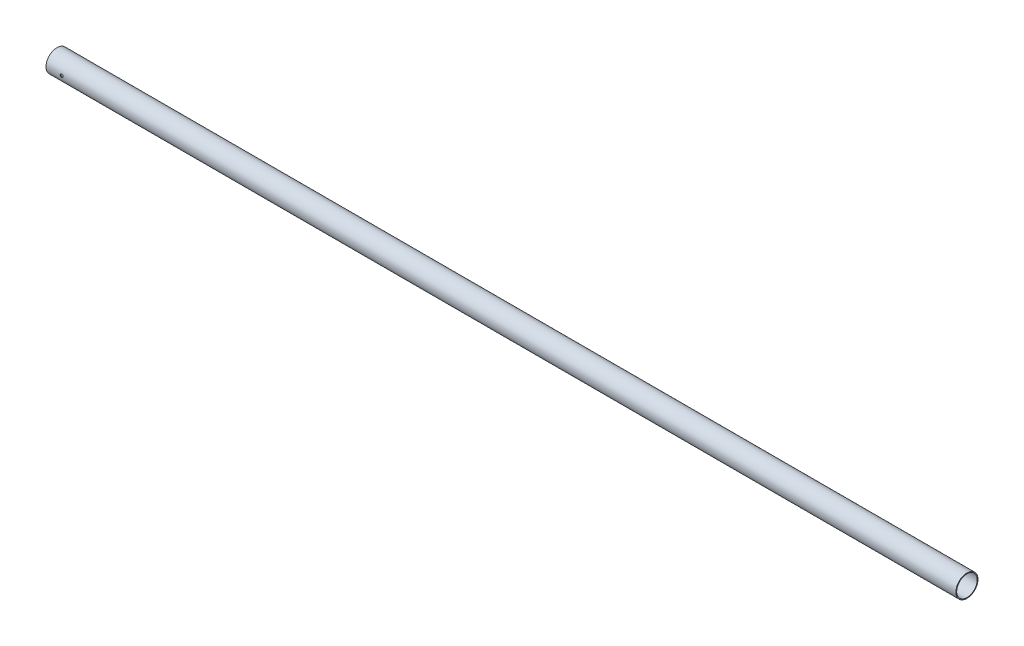
ISO-10303-21;
HEADER;
FILE_DESCRIPTION(('STEP AP214'),'2;1');
FILE_NAME('part.step','',(''),(''),'','','');
FILE_SCHEMA(('AUTOMOTIVE_DESIGN { 1 0 10303 214 1 1 1 1 }'));
ENDSEC;
DATA;
#1=APPLICATION_CONTEXT('core data for automotive mechanical design processes');
#2=APPLICATION_PROTOCOL_DEFINITION('international standard','automotive_design',2000,#1);
#3=PRODUCT_CONTEXT('',#1,'mechanical');
#4=PRODUCT('Part','Part','',(#3));
#5=PRODUCT_RELATED_PRODUCT_CATEGORY('part','',(#4));
#6=PRODUCT_DEFINITION_FORMATION('','',#4);
#7=PRODUCT_DEFINITION_CONTEXT('part definition',#1,'design');
#8=PRODUCT_DEFINITION('design','',#6,#7);
#9=PRODUCT_DEFINITION_SHAPE('','',#8);
#10=(LENGTH_UNIT() NAMED_UNIT(*) SI_UNIT(.MILLI.,.METRE.));
#11=(NAMED_UNIT(*) PLANE_ANGLE_UNIT() SI_UNIT($,.RADIAN.));
#12=(NAMED_UNIT(*) SI_UNIT($,.STERADIAN.) SOLID_ANGLE_UNIT());
#13=UNCERTAINTY_MEASURE_WITH_UNIT(LENGTH_MEASURE(1.E-05),#10,'distance_accuracy_value','');
#14=(GEOMETRIC_REPRESENTATION_CONTEXT(3) GLOBAL_UNCERTAINTY_ASSIGNED_CONTEXT((#13)) GLOBAL_UNIT_ASSIGNED_CONTEXT((#10,
#11,#12)) REPRESENTATION_CONTEXT('',''));
#15=CARTESIAN_POINT('',(0.,0.,0.));
#16=DIRECTION('',(0.,0.,1.));
#17=DIRECTION('',(1.,0.,0.));
#18=AXIS2_PLACEMENT_3D('',#15,#16,#17);
#19=CARTESIAN_POINT('',(1045.96,0.,0.));
#20=DIRECTION('',(1.,0.,0.));
#21=DIRECTION('',(0.,0.,-1.));
#22=AXIS2_PLACEMENT_3D('',#19,#20,#21);
#23=PLANE('',#22);
#24=CARTESIAN_POINT('',(1045.96,0.,0.));
#25=DIRECTION('',(1.,0.,0.));
#26=DIRECTION('',(0.,0.,-1.));
#27=AXIS2_PLACEMENT_3D('',#24,#25,#26);
#28=CIRCLE('',#27,12.7);
#29=CARTESIAN_POINT('',(1045.96,0.,-12.7));
#30=VERTEX_POINT('',#29);
#31=EDGE_CURVE('E10',#30,#30,#28,.T.);
#32=ORIENTED_EDGE('',*,*,#31,.T.);
#33=EDGE_LOOP('',(#32));
#34=FACE_BOUND('',#33,.T.);
#35=CARTESIAN_POINT('',(1045.96,0.,0.));
#36=DIRECTION('',(1.,0.,0.));
#37=DIRECTION('',(0.,0.,-1.));
#38=AXIS2_PLACEMENT_3D('',#35,#36,#37);
#39=CIRCLE('',#38,11.811);
#40=CARTESIAN_POINT('',(1045.96,0.,-11.811));
#41=VERTEX_POINT('',#40);
#42=EDGE_CURVE('E56',#41,#41,#39,.T.);
#43=ORIENTED_EDGE('',*,*,#42,.F.);
#44=EDGE_LOOP('',(#43));
#45=FACE_BOUND('',#44,.T.);
#46=ADVANCED_FACE('F37',(#34,#45),#23,.T.);
#47=CARTESIAN_POINT('',(0.,0.,0.));
#48=DIRECTION('',(1.,0.,0.));
#49=DIRECTION('',(0.,0.,-1.));
#50=AXIS2_PLACEMENT_3D('',#47,#48,#49);
#51=PLANE('',#50);
#52=CARTESIAN_POINT('',(0.,0.,0.));
#53=DIRECTION('',(1.,0.,0.));
#54=DIRECTION('',(0.,0.,-1.));
#55=AXIS2_PLACEMENT_3D('',#52,#53,#54);
#56=CIRCLE('',#55,12.7);
#57=CARTESIAN_POINT('',(0.,0.,-12.7));
#58=VERTEX_POINT('',#57);
#59=EDGE_CURVE('E51',#58,#58,#56,.T.);
#60=ORIENTED_EDGE('',*,*,#59,.F.);
#61=EDGE_LOOP('',(#60));
#62=FACE_BOUND('',#61,.T.);
#63=CARTESIAN_POINT('',(0.,0.,0.));
#64=DIRECTION('',(1.,0.,0.));
#65=DIRECTION('',(0.,0.,-1.));
#66=AXIS2_PLACEMENT_3D('',#63,#64,#65);
#67=CIRCLE('',#66,11.811);
#68=CARTESIAN_POINT('',(0.,0.,-11.811));
#69=VERTEX_POINT('',#68);
#70=EDGE_CURVE('E59',#69,#69,#67,.T.);
#71=ORIENTED_EDGE('',*,*,#70,.T.);
#72=EDGE_LOOP('',(#71));
#73=FACE_BOUND('',#72,.T.);
#74=ADVANCED_FACE('F95',(#62,#73),#51,.F.);
#75=CARTESIAN_POINT('',(1045.96,0.,0.));
#76=DIRECTION('',(-1.,0.,0.));
#77=DIRECTION('',(0.,0.,1.));
#78=AXIS2_PLACEMENT_3D('',#75,#76,#77);
#79=CYLINDRICAL_SURFACE('',#78,12.7);
#80=CARTESIAN_POINT('',(19.7,0.,-12.7));
#81=CARTESIAN_POINT('',(19.6999959992179,0.0950339668840666,-12.6999985995786));
#82=CARTESIAN_POINT('',(19.6920041882555,0.19012590693117,-12.69892205577));
#83=CARTESIAN_POINT('',(19.6602516928035,0.377659735515664,-12.6947310786922));
#84=CARTESIAN_POINT('',(19.6364749137547,0.470098818704447,-12.6916145654891));
#85=CARTESIAN_POINT('',(19.5738689603469,0.649585162895937,-12.6836944529743));
#86=CARTESIAN_POINT('',(19.5350503362114,0.736636153540407,-12.6788920363625));
#87=CARTESIAN_POINT('',(19.4434866282167,0.902972809326937,-12.668133083874));
#88=CARTESIAN_POINT('',(19.3907437804094,0.98225971848077,-12.6621767333452));
#89=CARTESIAN_POINT('',(19.2724752538047,1.13133074623819,-12.6497322350832));
#90=CARTESIAN_POINT('',(19.2068795471188,1.20105907920494,-12.6432412923369));
#91=CARTESIAN_POINT('',(19.0649178381758,1.32855287527093,-12.6304814917944));
#92=CARTESIAN_POINT('',(18.9885512647912,1.38631770360164,-12.6242126457971));
#93=CARTESIAN_POINT('',(18.8268487301552,1.48845585085959,-12.6125794864754));
#94=CARTESIAN_POINT('',(18.7414790965265,1.53277630674079,-12.6072187794791));
#95=CARTESIAN_POINT('',(18.5644244545483,1.60642994888796,-12.5980462279763));
#96=CARTESIAN_POINT('',(18.4727397204773,1.63576378559042,-12.5942343162519));
#97=CARTESIAN_POINT('',(18.2862392993217,1.67844067068208,-12.5886179602665));
#98=CARTESIAN_POINT('',(18.19144564102,1.69187839487359,-12.5868016351371));
#99=CARTESIAN_POINT('',(18.0009326732876,1.70267468090193,-12.5853458584028));
#100=CARTESIAN_POINT('',(17.9052134065726,1.70003398123825,-12.5857063068164));
#101=CARTESIAN_POINT('',(17.7162291334578,1.67882597900675,-12.5885524791077));
#102=CARTESIAN_POINT('',(17.6229521402506,1.66036334859318,-12.591024234991));
#103=CARTESIAN_POINT('',(17.4408322087313,1.60819906549934,-12.5977927233188));
#104=CARTESIAN_POINT('',(17.3519893722998,1.57449706285331,-12.6020894976741));
#105=CARTESIAN_POINT('',(17.180936742358,1.4926994268841,-12.6120395901206));
#106=CARTESIAN_POINT('',(17.0987487727502,1.44455869286377,-12.6176971476118));
#107=CARTESIAN_POINT('',(16.9435781710446,1.33528234667655,-12.6297281429156));
#108=CARTESIAN_POINT('',(16.8705960216702,1.27414605351568,-12.6361016182354));
#109=CARTESIAN_POINT('',(16.7353015027677,1.14003577368446,-12.6489082931571));
#110=CARTESIAN_POINT('',(16.673078463414,1.06697163981454,-12.655341565124));
#111=CARTESIAN_POINT('',(16.5617652939802,0.911389033566232,-12.6674957373912));
#112=CARTESIAN_POINT('',(16.5126752022542,0.828870533577836,-12.6732166356108));
#113=CARTESIAN_POINT('',(16.4290198450538,0.656649852468908,-12.6833057832175));
#114=CARTESIAN_POINT('',(16.3944606061958,0.566944709042034,-12.6876734711684));
#115=CARTESIAN_POINT('',(16.3409211232213,0.382932939657379,-12.6945591425037));
#116=CARTESIAN_POINT('',(16.3219400419676,0.288626561248753,-12.6970772252812));
#117=CARTESIAN_POINT('',(16.3002124588233,0.0988612499416711,-12.6999669678248));
#118=CARTESIAN_POINT('',(16.2973429834856,0.00341663518550021,-12.7003548857848));
#119=CARTESIAN_POINT('',(16.3075949092041,-0.186592199942903,-12.6989846078418));
#120=CARTESIAN_POINT('',(16.3207159184645,-0.281156441828657,-12.6972264645213));
#121=CARTESIAN_POINT('',(16.3624741566565,-0.466354124240493,-12.6917717046385));
#122=CARTESIAN_POINT('',(16.3910523228938,-0.557001118115943,-12.688082468612));
#123=CARTESIAN_POINT('',(16.4628519475053,-0.73221634230603,-12.6791782889493));
#124=CARTESIAN_POINT('',(16.5060739685466,-0.816784338893335,-12.6739632866891));
#125=CARTESIAN_POINT('',(16.6062288937945,-0.977987387725022,-12.6625478144558));
#126=CARTESIAN_POINT('',(16.6632408321252,-1.05457293223038,-12.6563417366426));
#127=CARTESIAN_POINT('',(16.7892460195627,-1.19713236803618,-12.6436547701942));
#128=CARTESIAN_POINT('',(16.8582398170769,-1.26310577335476,-12.6371738689908));
#129=CARTESIAN_POINT('',(17.006793907203,-1.38300824178855,-12.6246170593813));
#130=CARTESIAN_POINT('',(17.0864205322927,-1.43685547455966,-12.6185440858799));
#131=CARTESIAN_POINT('',(17.2536601808562,-1.53041060066335,-12.607540272347));
#132=CARTESIAN_POINT('',(17.3412730247706,-1.57011881179429,-12.6026094066456));
#133=CARTESIAN_POINT('',(17.5217407781579,-1.63413811770883,-12.5944685488549));
#134=CARTESIAN_POINT('',(17.6145794495971,-1.65849431867464,-12.5912535197242));
#135=CARTESIAN_POINT('',(17.8030751011367,-1.69126295280576,-12.5868942723901));
#136=CARTESIAN_POINT('',(17.8987319289187,-1.69967624606926,-12.5857499424755));
#137=CARTESIAN_POINT('',(18.0893339863174,-1.70030289341542,-12.5856652315807));
#138=CARTESIAN_POINT('',(18.1842788108431,-1.69264483293011,-12.5867073569543));
#139=CARTESIAN_POINT('',(18.3715183834309,-1.66161953930401,-12.5908403897388));
#140=CARTESIAN_POINT('',(18.463813132574,-1.6382523125708,-12.593931296314));
#141=CARTESIAN_POINT('',(18.6431094231047,-1.57651400196732,-12.601807977421));
#142=CARTESIAN_POINT('',(18.7301134601321,-1.53815005652329,-12.6065929454788));
#143=CARTESIAN_POINT('',(18.8964702488958,-1.44751995832389,-12.6173198076024));
#144=CARTESIAN_POINT('',(18.9758228494986,-1.39525353103899,-12.6232617245136));
#145=CARTESIAN_POINT('',(19.1252803268485,-1.27782820548912,-12.6356898389152));
#146=CARTESIAN_POINT('',(19.1953097247303,-1.21257363471889,-12.6421798563099));
#147=CARTESIAN_POINT('',(19.3234721297044,-1.07122538659935,-12.6549397826002));
#148=CARTESIAN_POINT('',(19.3816023430478,-0.995129170891949,-12.6612096395197));
#149=CARTESIAN_POINT('',(19.48453599194,-0.833873629090083,-12.6728533752327));
#150=CARTESIAN_POINT('',(19.5292802962862,-0.748676282109283,-12.6782232337741));
#151=CARTESIAN_POINT('',(19.6037608892282,-0.571949691102355,-12.6874217828558));
#152=CARTESIAN_POINT('',(19.63351323197,-0.48042734019212,-12.6912521210983));
#153=CARTESIAN_POINT('',(19.6701668573837,-0.32370968364222,-12.6960329483211));
#154=CARTESIAN_POINT('',(19.6813378724772,-0.259496143043121,-12.6975132154494));
#155=CARTESIAN_POINT('',(19.6962557812401,-0.130197467850004,-12.6994972166818));
#156=CARTESIAN_POINT('',(19.7000027411282,-0.0651123410353023,-12.700000959496));
#157=CARTESIAN_POINT('',(19.7,0.,-12.7));
#158=B_SPLINE_CURVE_WITH_KNOTS('',3,(#80,#81,#82,#83,#84,#85,#86,#87,#88,#89,#90,#91,#92,#93,
#94,#95,#96,#97,#98,#99,#100,#101,#102,#103,#104,#105,#106,#107,#108,#109,#110,#111,#112,#113,
#114,#115,#116,#117,#118,#119,#120,#121,#122,#123,#124,#125,#126,#127,#128,#129,#130,#131,#132,
#133,#134,#135,#136,#137,#138,#139,#140,#141,#142,#143,#144,#145,#146,#147,#148,#149,#150,#151,
#152,#153,#154,#155,#156,#157),.UNSPECIFIED.,.T.,.F.,(4,2,2,2,2,2,2,2,2,2,2,2,2,2,2,2,2,2,2,2,2,
2,2,2,2,2,2,2,2,2,2,2,2,2,2,2,2,2,4),(0.,0.284864035698537,0.570018969485685,0.854974258980744,
1.13988381611715,1.42639115813427,1.71291369797885,2.00054865692536,2.28817113112365,
2.57407178612564,2.85995930949888,3.14396997780514,3.42798716862777,3.71290091962872,
3.99782960437716,4.28502088941334,4.57221301316844,4.85952413156251,5.14681980945722,
5.43191966224501,5.71701252971187,6.00102365831222,6.28504570083371,6.57073582475008,
6.8564390280948,7.14401601038438,7.431586528488,7.71830813986012,8.0050142825509,
8.28943526420126,8.57385612983972,8.85814177590334,9.14243303611576,9.42890156631939,
9.71543727805735,10.0032206578249,10.290695206261,10.4858709975236,10.6810450479105),.UNSPECIFIED.);
#159=CARTESIAN_POINT('',(19.7,0.,-12.7));
#160=VERTEX_POINT('',#159);
#161=EDGE_CURVE('E84',#160,#160,#158,.T.);
#162=ORIENTED_EDGE('',*,*,#161,.T.);
#163=EDGE_LOOP('',(#162));
#164=FACE_BOUND('',#163,.T.);
#165=CARTESIAN_POINT('',(19.7,0.,12.7));
#166=CARTESIAN_POINT('',(19.6999959992179,-0.0950339668840666,12.6999985995786));
#167=CARTESIAN_POINT('',(19.6920041882555,-0.19012590693117,12.69892205577));
#168=CARTESIAN_POINT('',(19.6602516928035,-0.377659735515664,12.6947310786922));
#169=CARTESIAN_POINT('',(19.6364749137547,-0.470098818704447,12.6916145654891));
#170=CARTESIAN_POINT('',(19.5738689603469,-0.649585162895937,12.6836944529743));
#171=CARTESIAN_POINT('',(19.5350503362114,-0.736636153540407,12.6788920363625));
#172=CARTESIAN_POINT('',(19.4434866282167,-0.902972809326937,12.668133083874));
#173=CARTESIAN_POINT('',(19.3907437804094,-0.98225971848077,12.6621767333452));
#174=CARTESIAN_POINT('',(19.2724752538047,-1.13133074623819,12.6497322350832));
#175=CARTESIAN_POINT('',(19.2068795471188,-1.20105907920494,12.6432412923369));
#176=CARTESIAN_POINT('',(19.0649178381758,-1.32855287527093,12.6304814917944));
#177=CARTESIAN_POINT('',(18.9885512647912,-1.38631770360164,12.6242126457971));
#178=CARTESIAN_POINT('',(18.8268487301552,-1.48845585085959,12.6125794864754));
#179=CARTESIAN_POINT('',(18.7414790965265,-1.53277630674079,12.6072187794791));
#180=CARTESIAN_POINT('',(18.5644244545483,-1.60642994888796,12.5980462279763));
#181=CARTESIAN_POINT('',(18.4727397204773,-1.63576378559042,12.5942343162519));
#182=CARTESIAN_POINT('',(18.2862392993217,-1.67844067068208,12.5886179602665));
#183=CARTESIAN_POINT('',(18.19144564102,-1.69187839487359,12.5868016351371));
#184=CARTESIAN_POINT('',(18.0009326732876,-1.70267468090193,12.5853458584028));
#185=CARTESIAN_POINT('',(17.9052134065726,-1.70003398123825,12.5857063068164));
#186=CARTESIAN_POINT('',(17.7162291334578,-1.67882597900675,12.5885524791077));
#187=CARTESIAN_POINT('',(17.6229521402506,-1.66036334859318,12.591024234991));
#188=CARTESIAN_POINT('',(17.4408322087313,-1.60819906549934,12.5977927233188));
#189=CARTESIAN_POINT('',(17.3519893722998,-1.57449706285331,12.6020894976741));
#190=CARTESIAN_POINT('',(17.180936742358,-1.4926994268841,12.6120395901206));
#191=CARTESIAN_POINT('',(17.0987487727502,-1.44455869286377,12.6176971476118));
#192=CARTESIAN_POINT('',(16.9435781710446,-1.33528234667655,12.6297281429156));
#193=CARTESIAN_POINT('',(16.8705960216702,-1.27414605351568,12.6361016182354));
#194=CARTESIAN_POINT('',(16.7353015027677,-1.14003577368446,12.6489082931571));
#195=CARTESIAN_POINT('',(16.673078463414,-1.06697163981454,12.655341565124));
#196=CARTESIAN_POINT('',(16.5617652939802,-0.911389033566232,12.6674957373912));
#197=CARTESIAN_POINT('',(16.5126752022542,-0.828870533577836,12.6732166356108));
#198=CARTESIAN_POINT('',(16.4290198450538,-0.656649852468908,12.6833057832175));
#199=CARTESIAN_POINT('',(16.3944606061958,-0.566944709042034,12.6876734711684));
#200=CARTESIAN_POINT('',(16.3409211232213,-0.382932939657379,12.6945591425037));
#201=CARTESIAN_POINT('',(16.3219400419676,-0.288626561248753,12.6970772252812));
#202=CARTESIAN_POINT('',(16.3002124588233,-0.0988612499416711,12.6999669678248));
#203=CARTESIAN_POINT('',(16.2973429834856,-0.00341663518550021,12.7003548857848));
#204=CARTESIAN_POINT('',(16.3075949092041,0.186592199942903,12.6989846078418));
#205=CARTESIAN_POINT('',(16.3207159184645,0.281156441828657,12.6972264645213));
#206=CARTESIAN_POINT('',(16.3624741566565,0.466354124240493,12.6917717046385));
#207=CARTESIAN_POINT('',(16.3910523228938,0.557001118115943,12.688082468612));
#208=CARTESIAN_POINT('',(16.4628519475053,0.73221634230603,12.6791782889493));
#209=CARTESIAN_POINT('',(16.5060739685466,0.816784338893335,12.6739632866891));
#210=CARTESIAN_POINT('',(16.6062288937945,0.977987387725022,12.6625478144558));
#211=CARTESIAN_POINT('',(16.6632408321252,1.05457293223038,12.6563417366426));
#212=CARTESIAN_POINT('',(16.7892460195627,1.19713236803618,12.6436547701942));
#213=CARTESIAN_POINT('',(16.8582398170769,1.26310577335476,12.6371738689908));
#214=CARTESIAN_POINT('',(17.006793907203,1.38300824178855,12.6246170593813));
#215=CARTESIAN_POINT('',(17.0864205322927,1.43685547455966,12.6185440858799));
#216=CARTESIAN_POINT('',(17.2536601808562,1.53041060066335,12.607540272347));
#217=CARTESIAN_POINT('',(17.3412730247706,1.57011881179429,12.6026094066456));
#218=CARTESIAN_POINT('',(17.5217407781579,1.63413811770883,12.5944685488549));
#219=CARTESIAN_POINT('',(17.6145794495971,1.65849431867464,12.5912535197242));
#220=CARTESIAN_POINT('',(17.8030751011367,1.69126295280576,12.5868942723901));
#221=CARTESIAN_POINT('',(17.8987319289187,1.69967624606926,12.5857499424755));
#222=CARTESIAN_POINT('',(18.0893339863174,1.70030289341542,12.5856652315807));
#223=CARTESIAN_POINT('',(18.1842788108431,1.69264483293011,12.5867073569543));
#224=CARTESIAN_POINT('',(18.3715183834309,1.66161953930401,12.5908403897388));
#225=CARTESIAN_POINT('',(18.463813132574,1.6382523125708,12.593931296314));
#226=CARTESIAN_POINT('',(18.6431094231047,1.57651400196732,12.601807977421));
#227=CARTESIAN_POINT('',(18.7301134601321,1.53815005652329,12.6065929454788));
#228=CARTESIAN_POINT('',(18.8964702488958,1.44751995832389,12.6173198076024));
#229=CARTESIAN_POINT('',(18.9758228494986,1.39525353103899,12.6232617245136));
#230=CARTESIAN_POINT('',(19.1252803268485,1.27782820548912,12.6356898389152));
#231=CARTESIAN_POINT('',(19.1953097247303,1.21257363471889,12.6421798563099));
#232=CARTESIAN_POINT('',(19.3234721297044,1.07122538659935,12.6549397826002));
#233=CARTESIAN_POINT('',(19.3816023430478,0.995129170891949,12.6612096395197));
#234=CARTESIAN_POINT('',(19.48453599194,0.833873629090083,12.6728533752327));
#235=CARTESIAN_POINT('',(19.5292802962862,0.748676282109283,12.6782232337741));
#236=CARTESIAN_POINT('',(19.6037608892282,0.571949691102355,12.6874217828558));
#237=CARTESIAN_POINT('',(19.63351323197,0.48042734019212,12.6912521210983));
#238=CARTESIAN_POINT('',(19.6701668573837,0.32370968364222,12.6960329483211));
#239=CARTESIAN_POINT('',(19.6813378724772,0.259496143043121,12.6975132154494));
#240=CARTESIAN_POINT('',(19.6962557812401,0.130197467850004,12.6994972166818));
#241=CARTESIAN_POINT('',(19.7000027411282,0.0651123410353023,12.700000959496));
#242=CARTESIAN_POINT('',(19.7,0.,12.7));
#243=B_SPLINE_CURVE_WITH_KNOTS('',3,(#165,#166,#167,#168,#169,#170,#171,#172,#173,#174,#175,
#176,#177,#178,#179,#180,#181,#182,#183,#184,#185,#186,#187,#188,#189,#190,#191,#192,#193,#194,
#195,#196,#197,#198,#199,#200,#201,#202,#203,#204,#205,#206,#207,#208,#209,#210,#211,#212,#213,
#214,#215,#216,#217,#218,#219,#220,#221,#222,#223,#224,#225,#226,#227,#228,#229,#230,#231,#232,
#233,#234,#235,#236,#237,#238,#239,#240,#241,#242),.UNSPECIFIED.,.T.,.F.,(4,2,2,2,2,2,2,2,2,2,2,
2,2,2,2,2,2,2,2,2,2,2,2,2,2,2,2,2,2,2,2,2,2,2,2,2,2,2,4),(0.,0.284864035698537,
0.570018969485685,0.854974258980744,1.13988381611715,1.42639115813427,1.71291369797885,
2.00054865692536,2.28817113112365,2.57407178612564,2.85995930949888,3.14396997780514,
3.42798716862777,3.71290091962872,3.99782960437716,4.28502088941334,4.57221301316844,
4.85952413156251,5.14681980945722,5.43191966224501,5.71701252971187,6.00102365831222,
6.28504570083371,6.57073582475008,6.8564390280948,7.14401601038438,7.431586528488,
7.71830813986012,8.0050142825509,8.28943526420126,8.57385612983972,8.85814177590334,
9.14243303611576,9.42890156631939,9.71543727805735,10.0032206578249,10.290695206261,
10.4858709975236,10.6810450479105),.UNSPECIFIED.);
#244=CARTESIAN_POINT('',(19.7,0.,12.7));
#245=VERTEX_POINT('',#244);
#246=EDGE_CURVE('E79',#245,#245,#243,.T.);
#247=ORIENTED_EDGE('',*,*,#246,.T.);
#248=EDGE_LOOP('',(#247));
#249=FACE_BOUND('',#248,.T.);
#250=ORIENTED_EDGE('',*,*,#31,.F.);
#251=EDGE_LOOP('',(#250));
#252=FACE_BOUND('',#251,.T.);
#253=ORIENTED_EDGE('',*,*,#59,.T.);
#254=EDGE_LOOP('',(#253));
#255=FACE_BOUND('',#254,.T.);
#256=ADVANCED_FACE('F39',(#164,#249,#252,#255),#79,.T.);
#257=CARTESIAN_POINT('',(1045.96,0.,0.));
#258=DIRECTION('',(-1.,0.,0.));
#259=DIRECTION('',(0.,0.,1.));
#260=AXIS2_PLACEMENT_3D('',#257,#258,#259);
#261=CYLINDRICAL_SURFACE('',#260,11.811);
#262=CARTESIAN_POINT('',(19.7,0.,11.811));
#263=CARTESIAN_POINT('',(19.6999960506825,-0.0949633365740569,11.8109985219341));
#264=CARTESIAN_POINT('',(19.6920160552475,-0.189982877219708,11.8098426802892));
#265=CARTESIAN_POINT('',(19.6603132495635,-0.377369093460647,11.8053430227354));
#266=CARTESIAN_POINT('',(19.6365748230488,-0.469733042599291,11.8019970364864));
#267=CARTESIAN_POINT('',(19.5740765633508,-0.649068854078001,11.7934933444568));
#268=CARTESIAN_POINT('',(19.5353277640509,-0.736044622835741,11.7883369697238));
#269=CARTESIAN_POINT('',(19.4439349591902,-0.902245224987233,11.7767832373071));
#270=CARTESIAN_POINT('',(19.3912930000878,-0.981471197569839,11.7703860624296));
#271=CARTESIAN_POINT('',(19.2732030959118,-1.13050913396133,11.7570112315331));
#272=CARTESIAN_POINT('',(19.2076747326008,-1.20025707309759,11.7500300971524));
#273=CARTESIAN_POINT('',(19.0658451220361,-1.32780690367162,11.7363015989273));
#274=CARTESIAN_POINT('',(18.9895432747015,-1.3856081292376,11.7295542481307));
#275=CARTESIAN_POINT('',(18.8279058995033,-1.48787036847237,11.7170234438705));
#276=CARTESIAN_POINT('',(18.7425311085024,-1.53226992046287,11.7112444838184));
#277=CARTESIAN_POINT('',(18.5654391933575,-1.60607577266456,11.7013519190154));
#278=CARTESIAN_POINT('',(18.473722387587,-1.6354828248897,11.6972382307377));
#279=CARTESIAN_POINT('',(18.287221238183,-1.67827112473676,11.6911759676832));
#280=CARTESIAN_POINT('',(18.1924624498631,-1.69176163203234,11.6892126384495));
#281=CARTESIAN_POINT('',(18.0020072490258,-1.70267227309994,11.6876285186793));
#282=CARTESIAN_POINT('',(17.9063108864093,-1.70009325756097,11.6880076041401));
#283=CARTESIAN_POINT('',(17.7174661214855,-1.67902745255736,11.691051985365));
#284=CARTESIAN_POINT('',(17.6243038621422,-1.66066200271549,11.693699842128));
#285=CARTESIAN_POINT('',(17.4423972032276,-1.60873443984952,11.7009561911545));
#286=CARTESIAN_POINT('',(17.3536529196023,-1.57517192822512,11.7055647348442));
#287=CARTESIAN_POINT('',(17.1827301433947,-1.49367567025867,11.716242590323));
#288=CARTESIAN_POINT('',(17.1005766614923,-1.44569018392096,11.7223171454555));
#289=CARTESIAN_POINT('',(16.9454419332378,-1.33674699740009,11.7352387233349));
#290=CARTESIAN_POINT('',(16.8724612422249,-1.27578851240678,11.7420857928038));
#291=CARTESIAN_POINT('',(16.7370402316378,-1.14196200077654,11.7558580883074));
#292=CARTESIAN_POINT('',(16.6747030446548,-1.06898958032788,11.7627834539105));
#293=CARTESIAN_POINT('',(16.5631449214485,-0.913563355066816,11.7758734292219));
#294=CARTESIAN_POINT('',(16.5139240347357,-0.831109514466287,11.7820380360584));
#295=CARTESIAN_POINT('',(16.4299917699311,-0.658974172014321,11.7929176287989));
#296=CARTESIAN_POINT('',(16.3952879602131,-0.569288929110842,11.7976318582212));
#297=CARTESIAN_POINT('',(16.3414625975828,-0.385280648300725,11.8050730910877));
#298=CARTESIAN_POINT('',(16.3223400754528,-0.290957899252374,11.8078002181366));
#299=CARTESIAN_POINT('',(16.3003563446372,-0.101242607019846,11.8109436834614));
#300=CARTESIAN_POINT('',(16.2973532771797,-0.00586682355212268,11.811380179601));
#301=CARTESIAN_POINT('',(16.3073177263595,0.184026880290368,11.8099479582115));
#302=CARTESIAN_POINT('',(16.3202847888428,0.278544824983108,11.8080793062356));
#303=CARTESIAN_POINT('',(16.3617034710758,0.463613016155271,11.8022592312506));
#304=CARTESIAN_POINT('',(16.3900863585206,0.554178960795697,11.7983170556067));
#305=CARTESIAN_POINT('',(16.4614587888451,0.729266418257608,11.7887906933605));
#306=CARTESIAN_POINT('',(16.5044489700626,0.813787666730863,11.7832064350008));
#307=CARTESIAN_POINT('',(16.6041511523142,0.975012812185227,11.7709668100829));
#308=CARTESIAN_POINT('',(16.6609536014292,1.05166023789249,11.7643044843033));
#309=CARTESIAN_POINT('',(16.7865414587591,1.19438484899554,11.750672986933));
#310=CARTESIAN_POINT('',(16.8553275054601,1.26046147081892,11.7437037990075));
#311=CARTESIAN_POINT('',(17.003559830618,1.38068166669794,11.7301805683755));
#312=CARTESIAN_POINT('',(17.0830833909513,1.43473041373841,11.7236300961746));
#313=CARTESIAN_POINT('',(17.2501637244195,1.52870253161708,11.7117480571151));
#314=CARTESIAN_POINT('',(17.3377202942297,1.56862625985151,11.7064164594173));
#315=CARTESIAN_POINT('',(17.5180924831322,1.6330663713551,11.6976013208194));
#316=CARTESIAN_POINT('',(17.6108896352666,1.6576335753935,11.6941116901567));
#317=CARTESIAN_POINT('',(17.7993464367159,1.69082554924417,11.6893590853919));
#318=CARTESIAN_POINT('',(17.8950059049259,1.6994513255461,11.6880959707151));
#319=CARTESIAN_POINT('',(18.0855272553967,1.70049305790303,11.6879443741982));
#320=CARTESIAN_POINT('',(18.180388339111,1.69305807386296,11.6890340560121));
#321=CARTESIAN_POINT('',(18.3674964573984,1.66250778747196,11.6934179490026));
#322=CARTESIAN_POINT('',(18.4597434948784,1.63939250255821,11.6967121577278));
#323=CARTESIAN_POINT('',(18.6389692279335,1.57818894246534,11.7051265233326));
#324=CARTESIAN_POINT('',(18.7259512568652,1.54011025772638,11.7102455104686));
#325=CARTESIAN_POINT('',(18.8923159801059,1.45007554750406,11.7217341938223));
#326=CARTESIAN_POINT('',(18.9716984583745,1.39811912766296,11.7281039255805));
#327=CARTESIAN_POINT('',(19.1213693369344,1.2812591410815,11.7414469050402));
#328=CARTESIAN_POINT('',(19.1915709499774,1.2162449615365,11.7484249990409));
#329=CARTESIAN_POINT('',(19.3201216216477,1.07534846350219,11.7621573750622));
#330=CARTESIAN_POINT('',(19.3784679127108,0.999463614343984,11.7689116045154));
#331=CARTESIAN_POINT('',(19.4819122735376,0.83853133913813,11.7814739265501));
#332=CARTESIAN_POINT('',(19.5269419649513,0.753439585305897,11.787277069854));
#333=CARTESIAN_POINT('',(19.6020042533168,0.576859476383486,11.7972345527272));
#334=CARTESIAN_POINT('',(19.632052581816,0.485377946647713,11.801390620903));
#335=CARTESIAN_POINT('',(19.6693842114288,0.327890845246801,11.8066231007302));
#336=CARTESIAN_POINT('',(19.680847861636,0.262863239839553,11.8082561218876));
#337=CARTESIAN_POINT('',(19.6961570856845,0.131899455682025,11.8104450789484));
#338=CARTESIAN_POINT('',(19.7000027432689,0.0659632869274253,11.8110010266919));
#339=CARTESIAN_POINT('',(19.7,0.,11.811));
#340=B_SPLINE_CURVE_WITH_KNOTS('',3,(#262,#263,#264,#265,#266,#267,#268,#269,#270,#271,#272,
#273,#274,#275,#276,#277,#278,#279,#280,#281,#282,#283,#284,#285,#286,#287,#288,#289,#290,#291,
#292,#293,#294,#295,#296,#297,#298,#299,#300,#301,#302,#303,#304,#305,#306,#307,#308,#309,#310,
#311,#312,#313,#314,#315,#316,#317,#318,#319,#320,#321,#322,#323,#324,#325,#326,#327,#328,#329,
#330,#331,#332,#333,#334,#335,#336,#337,#338,#339),.UNSPECIFIED.,.T.,.F.,(4,2,2,2,2,2,2,2,2,2,2,
2,2,2,2,2,2,2,2,2,2,2,2,2,2,2,2,2,2,2,2,2,2,2,2,2,2,2,4),(0.,0.284648997756756,
0.569580498473071,0.854302946868714,1.13898347911696,1.42550042768716,1.71203334149623,
1.99986103307518,2.2876742859853,2.5735001221883,2.85931082746098,3.14294414558129,
3.42658490348702,3.711255571745,3.9959434662417,4.28325010816804,4.570557834584,
4.85801516070151,5.1454546044716,5.43036024797864,5.71525778960857,5.9988954041135,
6.28254541515722,6.56810541339531,6.85368063092428,7.14143326657706,7.42917862088989,
7.71596659993671,8.00273647150893,8.28685627476276,8.57097576206354,8.8549134458757,
9.13885919908395,9.4253202309991,9.71184805913824,9.99982258064417,10.287494067183,
10.4852186901637,10.6829411395849),.UNSPECIFIED.);
#341=CARTESIAN_POINT('',(19.7,0.,11.811));
#342=VERTEX_POINT('',#341);
#343=EDGE_CURVE('E42',#342,#342,#340,.T.);
#344=ORIENTED_EDGE('',*,*,#343,.F.);
#345=EDGE_LOOP('',(#344));
#346=FACE_BOUND('',#345,.T.);
#347=CARTESIAN_POINT('',(19.7,0.,-11.811));
#348=CARTESIAN_POINT('',(19.6999960506825,0.0949633365740576,-11.8109985219341));
#349=CARTESIAN_POINT('',(19.6920160552475,0.189982877219709,-11.8098426802892));
#350=CARTESIAN_POINT('',(19.6603132495635,0.377369093460649,-11.8053430227354));
#351=CARTESIAN_POINT('',(19.6365748230488,0.469733042599292,-11.8019970364864));
#352=CARTESIAN_POINT('',(19.5740765633508,0.649068854078,-11.7934933444568));
#353=CARTESIAN_POINT('',(19.5353277640509,0.736044622835739,-11.7883369697238));
#354=CARTESIAN_POINT('',(19.4439349591902,0.902245224987231,-11.7767832373071));
#355=CARTESIAN_POINT('',(19.3912930000878,0.981471197569838,-11.7703860624296));
#356=CARTESIAN_POINT('',(19.2732030959118,1.13050913396133,-11.7570112315331));
#357=CARTESIAN_POINT('',(19.2076747326008,1.20025707309759,-11.7500300971524));
#358=CARTESIAN_POINT('',(19.0658451220361,1.32780690367162,-11.7363015989273));
#359=CARTESIAN_POINT('',(18.9895432747015,1.3856081292376,-11.7295542481307));
#360=CARTESIAN_POINT('',(18.8279058995033,1.48787036847237,-11.7170234438705));
#361=CARTESIAN_POINT('',(18.7425311085024,1.53226992046287,-11.7112444838184));
#362=CARTESIAN_POINT('',(18.5654391933575,1.60607577266456,-11.7013519190154));
#363=CARTESIAN_POINT('',(18.473722387587,1.6354828248897,-11.6972382307377));
#364=CARTESIAN_POINT('',(18.287221238183,1.67827112473676,-11.6911759676832));
#365=CARTESIAN_POINT('',(18.1924624498631,1.69176163203234,-11.6892126384495));
#366=CARTESIAN_POINT('',(18.0020072490258,1.70267227309994,-11.6876285186793));
#367=CARTESIAN_POINT('',(17.9063108864093,1.70009325756097,-11.6880076041401));
#368=CARTESIAN_POINT('',(17.7174661214855,1.67902745255736,-11.691051985365));
#369=CARTESIAN_POINT('',(17.6243038621422,1.66066200271549,-11.693699842128));
#370=CARTESIAN_POINT('',(17.4423972032276,1.60873443984952,-11.7009561911545));
#371=CARTESIAN_POINT('',(17.3536529196023,1.57517192822512,-11.7055647348442));
#372=CARTESIAN_POINT('',(17.1827301433947,1.49367567025867,-11.716242590323));
#373=CARTESIAN_POINT('',(17.1005766614923,1.44569018392096,-11.7223171454555));
#374=CARTESIAN_POINT('',(16.9454419332378,1.33674699740009,-11.7352387233349));
#375=CARTESIAN_POINT('',(16.8724612422249,1.27578851240678,-11.7420857928038));
#376=CARTESIAN_POINT('',(16.7370402316378,1.14196200077654,-11.7558580883074));
#377=CARTESIAN_POINT('',(16.6747030446548,1.06898958032788,-11.7627834539105));
#378=CARTESIAN_POINT('',(16.5631449214485,0.913563355066816,-11.7758734292219));
#379=CARTESIAN_POINT('',(16.5139240347357,0.831109514466287,-11.7820380360584));
#380=CARTESIAN_POINT('',(16.4299917699311,0.658974172014321,-11.7929176287989));
#381=CARTESIAN_POINT('',(16.3952879602131,0.569288929110842,-11.7976318582212));
#382=CARTESIAN_POINT('',(16.3414625975828,0.385280648300726,-11.8050730910877));
#383=CARTESIAN_POINT('',(16.3223400754528,0.290957899252374,-11.8078002181366));
#384=CARTESIAN_POINT('',(16.3003563446372,0.101242607019846,-11.8109436834614));
#385=CARTESIAN_POINT('',(16.2973532771797,0.00586682355212304,-11.811380179601));
#386=CARTESIAN_POINT('',(16.3073177263595,-0.184026880290368,-11.8099479582115));
#387=CARTESIAN_POINT('',(16.3202847888428,-0.278544824983107,-11.8080793062356));
#388=CARTESIAN_POINT('',(16.3617034710758,-0.463613016155271,-11.8022592312506));
#389=CARTESIAN_POINT('',(16.3900863585206,-0.554178960795696,-11.7983170556067));
#390=CARTESIAN_POINT('',(16.4614587888451,-0.729266418257607,-11.7887906933605));
#391=CARTESIAN_POINT('',(16.5044489700626,-0.813787666730862,-11.7832064350008));
#392=CARTESIAN_POINT('',(16.6041511523142,-0.975012812185226,-11.770966810083));
#393=CARTESIAN_POINT('',(16.6609536014292,-1.05166023789249,-11.7643044843033));
#394=CARTESIAN_POINT('',(16.7865414587591,-1.19438484899554,-11.750672986933));
#395=CARTESIAN_POINT('',(16.8553275054601,-1.26046147081892,-11.7437037990075));
#396=CARTESIAN_POINT('',(17.003559830618,-1.38068166669794,-11.7301805683755));
#397=CARTESIAN_POINT('',(17.0830833909513,-1.43473041373841,-11.7236300961746));
#398=CARTESIAN_POINT('',(17.2501637244195,-1.52870253161708,-11.7117480571151));
#399=CARTESIAN_POINT('',(17.3377202942297,-1.56862625985151,-11.7064164594173));
#400=CARTESIAN_POINT('',(17.5180924831322,-1.6330663713551,-11.6976013208194));
#401=CARTESIAN_POINT('',(17.6108896352666,-1.6576335753935,-11.6941116901567));
#402=CARTESIAN_POINT('',(17.7993464367159,-1.69082554924417,-11.6893590853919));
#403=CARTESIAN_POINT('',(17.8950059049259,-1.6994513255461,-11.6880959707151));
#404=CARTESIAN_POINT('',(18.0855272553967,-1.70049305790303,-11.6879443741982));
#405=CARTESIAN_POINT('',(18.180388339111,-1.69305807386296,-11.6890340560121));
#406=CARTESIAN_POINT('',(18.3674964573984,-1.66250778747196,-11.6934179490026));
#407=CARTESIAN_POINT('',(18.4597434948784,-1.63939250255821,-11.6967121577278));
#408=CARTESIAN_POINT('',(18.6389692279335,-1.57818894246534,-11.7051265233326));
#409=CARTESIAN_POINT('',(18.7259512568652,-1.54011025772638,-11.7102455104686));
#410=CARTESIAN_POINT('',(18.8923159801059,-1.45007554750406,-11.7217341938223));
#411=CARTESIAN_POINT('',(18.9716984583745,-1.39811912766296,-11.7281039255805));
#412=CARTESIAN_POINT('',(19.1213693369344,-1.2812591410815,-11.7414469050402));
#413=CARTESIAN_POINT('',(19.1915709499774,-1.2162449615365,-11.7484249990409));
#414=CARTESIAN_POINT('',(19.3201216216477,-1.07534846350219,-11.7621573750622));
#415=CARTESIAN_POINT('',(19.3784679127108,-0.999463614343984,-11.7689116045154));
#416=CARTESIAN_POINT('',(19.4819122735376,-0.83853133913813,-11.7814739265501));
#417=CARTESIAN_POINT('',(19.5269419649513,-0.753439585305898,-11.787277069854));
#418=CARTESIAN_POINT('',(19.6020042533168,-0.576859476383486,-11.7972345527272));
#419=CARTESIAN_POINT('',(19.632052581816,-0.485377946647713,-11.801390620903));
#420=CARTESIAN_POINT('',(19.6693842114288,-0.327890845246802,-11.8066231007302));
#421=CARTESIAN_POINT('',(19.680847861636,-0.262863239839554,-11.8082561218876));
#422=CARTESIAN_POINT('',(19.6961570856845,-0.131899455682027,-11.8104450789484));
#423=CARTESIAN_POINT('',(19.7000027432689,-0.065963286927426,-11.8110010266919));
#424=CARTESIAN_POINT('',(19.7,0.,-11.811));
#425=B_SPLINE_CURVE_WITH_KNOTS('',3,(#347,#348,#349,#350,#351,#352,#353,#354,#355,#356,#357,
#358,#359,#360,#361,#362,#363,#364,#365,#366,#367,#368,#369,#370,#371,#372,#373,#374,#375,#376,
#377,#378,#379,#380,#381,#382,#383,#384,#385,#386,#387,#388,#389,#390,#391,#392,#393,#394,#395,
#396,#397,#398,#399,#400,#401,#402,#403,#404,#405,#406,#407,#408,#409,#410,#411,#412,#413,#414,
#415,#416,#417,#418,#419,#420,#421,#422,#423,#424),.UNSPECIFIED.,.T.,.F.,(4,2,2,2,2,2,2,2,2,2,2,
2,2,2,2,2,2,2,2,2,2,2,2,2,2,2,2,2,2,2,2,2,2,2,2,2,2,2,4),(0.,0.284648997756756,0.56958049847307,
0.85430294686871,1.13898347911695,1.42550042768716,1.71203334149623,1.99986103307517,
2.2876742859853,2.57350012218829,2.85931082746098,3.14294414558129,3.42658490348701,
3.711255571745,3.9959434662417,4.28325010816803,4.570557834584,4.85801516070151,
5.14545460447159,5.43036024797864,5.71525778960856,5.9988954041135,6.28254541515722,
6.56810541339531,6.85368063092427,7.14143326657706,7.42917862088989,7.7159665999367,
8.00273647150893,8.28685627476276,8.57097576206353,8.8549134458757,9.13885919908395,
9.4253202309991,9.71184805913824,9.99982258064417,10.287494067183,10.4852186901637,
10.6829411395849),.UNSPECIFIED.);
#426=CARTESIAN_POINT('',(19.7,0.,-11.811));
#427=VERTEX_POINT('',#426);
#428=EDGE_CURVE('E61',#427,#427,#425,.T.);
#429=ORIENTED_EDGE('',*,*,#428,.F.);
#430=EDGE_LOOP('',(#429));
#431=FACE_BOUND('',#430,.T.);
#432=ORIENTED_EDGE('',*,*,#42,.T.);
#433=EDGE_LOOP('',(#432));
#434=FACE_BOUND('',#433,.T.);
#435=ORIENTED_EDGE('',*,*,#70,.F.);
#436=EDGE_LOOP('',(#435));
#437=FACE_BOUND('',#436,.T.);
#438=ADVANCED_FACE('F66',(#346,#431,#434,#437),#261,.F.);
#439=CARTESIAN_POINT('',(18.,0.,-12.7));
#440=DIRECTION('',(0.,0.,1.));
#441=DIRECTION('',(1.,0.,0.));
#442=AXIS2_PLACEMENT_3D('',#439,#440,#441);
#443=CYLINDRICAL_SURFACE('',#442,1.7);
#444=ORIENTED_EDGE('',*,*,#428,.T.);
#445=EDGE_LOOP('',(#444));
#446=FACE_BOUND('',#445,.T.);
#447=ORIENTED_EDGE('',*,*,#161,.F.);
#448=EDGE_LOOP('',(#447));
#449=FACE_BOUND('',#448,.T.);
#450=ADVANCED_FACE('F69',(#446,#449),#443,.F.);
#451=ORIENTED_EDGE('',*,*,#343,.T.);
#452=EDGE_LOOP('',(#451));
#453=FACE_BOUND('',#452,.T.);
#454=ORIENTED_EDGE('',*,*,#246,.F.);
#455=EDGE_LOOP('',(#454));
#456=FACE_BOUND('',#455,.T.);
#457=ADVANCED_FACE('F72',(#453,#456),#443,.F.);
#458=CLOSED_SHELL('',(#46,#74,#256,#438,#450,#457));
#459=MANIFOLD_SOLID_BREP('B2',#458);
#460=ADVANCED_BREP_SHAPE_REPRESENTATION('',(#18,#459),#14);
#461=SHAPE_DEFINITION_REPRESENTATION(#9,#460);
ENDSEC;
END-ISO-10303-21;
